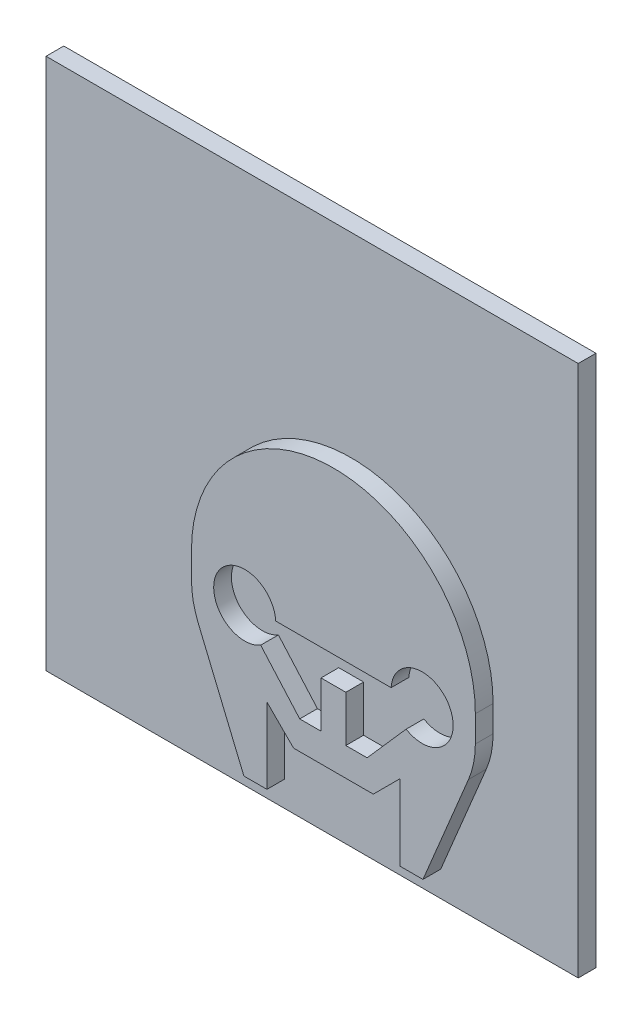
ISO-10303-21;
HEADER;
FILE_DESCRIPTION(('STEP AP214'),'2;1');
FILE_NAME('part.step','',(''),(''),'','','');
FILE_SCHEMA(('AUTOMOTIVE_DESIGN { 1 0 10303 214 1 1 1 1 }'));
ENDSEC;
DATA;
#1=APPLICATION_CONTEXT('core data for automotive mechanical design processes');
#2=APPLICATION_PROTOCOL_DEFINITION('international standard','automotive_design',2000,#1);
#3=PRODUCT_CONTEXT('',#1,'mechanical');
#4=PRODUCT('Part','Part','',(#3));
#5=PRODUCT_RELATED_PRODUCT_CATEGORY('part','',(#4));
#6=PRODUCT_DEFINITION_FORMATION('','',#4);
#7=PRODUCT_DEFINITION_CONTEXT('part definition',#1,'design');
#8=PRODUCT_DEFINITION('design','',#6,#7);
#9=PRODUCT_DEFINITION_SHAPE('','',#8);
#10=(LENGTH_UNIT() NAMED_UNIT(*) SI_UNIT(.MILLI.,.METRE.));
#11=(NAMED_UNIT(*) PLANE_ANGLE_UNIT() SI_UNIT($,.RADIAN.));
#12=(NAMED_UNIT(*) SI_UNIT($,.STERADIAN.) SOLID_ANGLE_UNIT());
#13=UNCERTAINTY_MEASURE_WITH_UNIT(LENGTH_MEASURE(1.E-05),#10,'distance_accuracy_value','');
#14=(GEOMETRIC_REPRESENTATION_CONTEXT(3) GLOBAL_UNCERTAINTY_ASSIGNED_CONTEXT((#13)) GLOBAL_UNIT_ASSIGNED_CONTEXT((#10,
#11,#12)) REPRESENTATION_CONTEXT('',''));
#15=CARTESIAN_POINT('',(0.,0.,0.));
#16=DIRECTION('',(0.,0.,1.));
#17=DIRECTION('',(1.,0.,0.));
#18=AXIS2_PLACEMENT_3D('',#15,#16,#17);
#19=CARTESIAN_POINT('',(0.,0.,10.));
#20=DIRECTION('',(0.,0.,-1.));
#21=DIRECTION('',(-1.,0.,0.));
#22=AXIS2_PLACEMENT_3D('',#19,#20,#21);
#23=PLANE('',#22);
#24=DIRECTION('',(0.,-1.,0.));
#25=VECTOR('',#24,1.);
#26=CARTESIAN_POINT('',(252.,0.,10.));
#27=LINE('',#26,#25);
#28=CARTESIAN_POINT('',(252.,110.,10.));
#29=VERTEX_POINT('',#28);
#30=CARTESIAN_POINT('',(252.,95.2298661303996,10.));
#31=VERTEX_POINT('',#30);
#32=EDGE_CURVE('E308',#29,#31,#27,.T.);
#33=ORIENTED_EDGE('',*,*,#32,.T.);
#34=CARTESIAN_POINT('',(202.,95.2298661303996,10.));
#35=DIRECTION('',(0.,0.,1.));
#36=DIRECTION('',(1.,0.,0.));
#37=AXIS2_PLACEMENT_3D('',#34,#35,#36);
#38=CIRCLE('',#37,50.);
#39=CARTESIAN_POINT('',(248.153836394722,75.9990734777494,10.));
#40=VERTEX_POINT('',#39);
#41=EDGE_CURVE('E58',#31,#40,#38,.F.);
#42=ORIENTED_EDGE('',*,*,#41,.T.);
#43=DIRECTION('',(-0.384615853053004,-0.923076727894442,0.));
#44=VECTOR('',#43,1.);
#45=CARTESIAN_POINT('',(184.462652845154,-76.859548547271,10.));
#46=LINE('',#45,#44);
#47=CARTESIAN_POINT('',(222.47286206477,14.3648231849862,10.));
#48=VERTEX_POINT('',#47);
#49=EDGE_CURVE('E336',#40,#48,#46,.T.);
#50=ORIENTED_EDGE('',*,*,#49,.T.);
#51=DIRECTION('',(-1.,0.,0.));
#52=VECTOR('',#51,1.);
#53=CARTESIAN_POINT('',(0.,14.3648231849862,10.));
#54=LINE('',#53,#52);
#55=CARTESIAN_POINT('',(209.47286206477,14.3648231849862,10.));
#56=VERTEX_POINT('',#55);
#57=EDGE_CURVE('E333',#48,#56,#54,.T.);
#58=ORIENTED_EDGE('',*,*,#57,.T.);
#59=DIRECTION('',(0.,1.,0.));
#60=VECTOR('',#59,1.);
#61=CARTESIAN_POINT('',(209.47286206477,0.,10.));
#62=LINE('',#61,#60);
#63=CARTESIAN_POINT('',(209.47286206477,57.,10.));
#64=VERTEX_POINT('',#63);
#65=EDGE_CURVE('E330',#56,#64,#62,.T.);
#66=ORIENTED_EDGE('',*,*,#65,.T.);
#67=DIRECTION('',(-0.707106781186544,-0.707106781186551,0.));
#68=VECTOR('',#67,1.);
#69=CARTESIAN_POINT('',(76.236431032386,-76.2364310323852,10.));
#70=LINE('',#69,#68);
#71=CARTESIAN_POINT('',(194.47286206477,42.,10.));
#72=VERTEX_POINT('',#71);
#73=EDGE_CURVE('E327',#64,#72,#70,.T.);
#74=ORIENTED_EDGE('',*,*,#73,.T.);
#75=DIRECTION('',(1.,0.,0.));
#76=VECTOR('',#75,1.);
#77=CARTESIAN_POINT('',(0.,42.,10.));
#78=LINE('',#77,#76);
#79=CARTESIAN_POINT('',(149.52713793523,42.,10.));
#80=VERTEX_POINT('',#79);
#81=EDGE_CURVE('E324',#80,#72,#78,.T.);
#82=ORIENTED_EDGE('',*,*,#81,.F.);
#83=DIRECTION('',(0.707106781186544,-0.707106781186551,0.));
#84=VECTOR('',#83,1.);
#85=CARTESIAN_POINT('',(95.7635689676158,95.7635689676148,10.));
#86=LINE('',#85,#84);
#87=CARTESIAN_POINT('',(134.52713793523,57.,10.));
#88=VERTEX_POINT('',#87);
#89=EDGE_CURVE('E322',#88,#80,#86,.T.);
#90=ORIENTED_EDGE('',*,*,#89,.F.);
#91=DIRECTION('',(0.,1.,0.));
#92=VECTOR('',#91,1.);
#93=CARTESIAN_POINT('',(134.52713793523,0.,10.));
#94=LINE('',#93,#92);
#95=CARTESIAN_POINT('',(134.52713793523,14.3648231849862,10.));
#96=VERTEX_POINT('',#95);
#97=EDGE_CURVE('E320',#96,#88,#94,.T.);
#98=ORIENTED_EDGE('',*,*,#97,.F.);
#99=DIRECTION('',(1.,0.,0.));
#100=VECTOR('',#99,1.);
#101=CARTESIAN_POINT('',(0.,14.3648231849862,10.));
#102=LINE('',#101,#100);
#103=CARTESIAN_POINT('',(121.52713793523,14.3648231849862,10.));
#104=VERTEX_POINT('',#103);
#105=EDGE_CURVE('E318',#104,#96,#102,.T.);
#106=ORIENTED_EDGE('',*,*,#105,.F.);
#107=DIRECTION('',(0.384615853053004,-0.923076727894442,0.));
#108=VECTOR('',#107,1.);
#109=CARTESIAN_POINT('',(108.649649234473,45.2707518903078,10.));
#110=LINE('',#109,#108);
#111=CARTESIAN_POINT('',(95.8461636052779,75.9990734777494,10.));
#112=VERTEX_POINT('',#111);
#113=EDGE_CURVE('E316',#112,#104,#110,.T.);
#114=ORIENTED_EDGE('',*,*,#113,.F.);
#115=CARTESIAN_POINT('',(142.,95.2298661303996,10.));
#116=DIRECTION('',(0.,0.,1.));
#117=DIRECTION('',(1.,0.,0.));
#118=AXIS2_PLACEMENT_3D('',#115,#116,#117);
#119=CIRCLE('',#118,50.);
#120=CARTESIAN_POINT('',(92.,95.2298661303996,10.));
#121=VERTEX_POINT('',#120);
#122=EDGE_CURVE('E314',#121,#112,#119,.T.);
#123=ORIENTED_EDGE('',*,*,#122,.F.);
#124=DIRECTION('',(0.,-1.,0.));
#125=VECTOR('',#124,1.);
#126=CARTESIAN_POINT('',(92.0000000000003,2.59325302585117E-13,10.));
#127=LINE('',#126,#125);
#128=CARTESIAN_POINT('',(92.,110.,10.));
#129=VERTEX_POINT('',#128);
#130=EDGE_CURVE('E312',#129,#121,#127,.T.);
#131=ORIENTED_EDGE('',*,*,#130,.F.);
#132=CARTESIAN_POINT('',(172.,110.,10.));
#133=DIRECTION('',(0.,0.,1.));
#134=DIRECTION('',(1.,0.,0.));
#135=AXIS2_PLACEMENT_3D('',#132,#133,#134);
#136=CIRCLE('',#135,80.);
#137=EDGE_CURVE('E310',#29,#129,#136,.T.);
#138=ORIENTED_EDGE('',*,*,#137,.F.);
#139=EDGE_LOOP('',(#33,#42,#50,#58,#66,#74,#82,#90,#98,#106,#114,#123,#131,#138));
#140=FACE_BOUND('',#139,.T.);
#141=DIRECTION('',(0.,-1.,0.));
#142=VECTOR('',#141,1.);
#143=CARTESIAN_POINT('',(0.,0.,10.));
#144=LINE('',#143,#142);
#145=CARTESIAN_POINT('',(0.,300.,10.));
#146=VERTEX_POINT('',#145);
#147=CARTESIAN_POINT('',(0.,0.,10.));
#148=VERTEX_POINT('',#147);
#149=EDGE_CURVE('E417',#146,#148,#144,.T.);
#150=ORIENTED_EDGE('',*,*,#149,.T.);
#151=DIRECTION('',(1.,0.,0.));
#152=VECTOR('',#151,1.);
#153=CARTESIAN_POINT('',(0.,0.,10.));
#154=LINE('',#153,#152);
#155=CARTESIAN_POINT('',(300.,0.,10.));
#156=VERTEX_POINT('',#155);
#157=EDGE_CURVE('E420',#148,#156,#154,.T.);
#158=ORIENTED_EDGE('',*,*,#157,.T.);
#159=DIRECTION('',(0.,1.,0.));
#160=VECTOR('',#159,1.);
#161=CARTESIAN_POINT('',(300.,0.,10.));
#162=LINE('',#161,#160);
#163=CARTESIAN_POINT('',(300.,300.,10.));
#164=VERTEX_POINT('',#163);
#165=EDGE_CURVE('E423',#156,#164,#162,.T.);
#166=ORIENTED_EDGE('',*,*,#165,.T.);
#167=DIRECTION('',(-1.,0.,0.));
#168=VECTOR('',#167,1.);
#169=CARTESIAN_POINT('',(0.,300.,10.));
#170=LINE('',#169,#168);
#171=EDGE_CURVE('E425',#164,#146,#170,.T.);
#172=ORIENTED_EDGE('',*,*,#171,.T.);
#173=EDGE_LOOP('',(#150,#158,#166,#172));
#174=FACE_BOUND('',#173,.T.);
#175=ADVANCED_FACE('F43',(#140,#174),#23,.F.);
#176=CARTESIAN_POINT('',(0.,0.,10.));
#177=DIRECTION('',(1.,0.,0.));
#178=DIRECTION('',(0.,0.,-1.));
#179=AXIS2_PLACEMENT_3D('',#176,#177,#178);
#180=PLANE('',#179);
#181=DIRECTION('',(0.,-1.,0.));
#182=VECTOR('',#181,1.);
#183=CARTESIAN_POINT('',(0.,0.,0.));
#184=LINE('',#183,#182);
#185=CARTESIAN_POINT('',(0.,300.,0.));
#186=VERTEX_POINT('',#185);
#187=CARTESIAN_POINT('',(0.,0.,0.));
#188=VERTEX_POINT('',#187);
#189=EDGE_CURVE('E385',#186,#188,#184,.T.);
#190=ORIENTED_EDGE('',*,*,#189,.T.);
#191=DIRECTION('',(0.,0.,-1.));
#192=VECTOR('',#191,1.);
#193=CARTESIAN_POINT('',(0.,0.,10.));
#194=LINE('',#193,#192);
#195=EDGE_CURVE('E11',#148,#188,#194,.T.);
#196=ORIENTED_EDGE('',*,*,#195,.F.);
#197=ORIENTED_EDGE('',*,*,#149,.F.);
#198=DIRECTION('',(0.,0.,-1.));
#199=VECTOR('',#198,1.);
#200=CARTESIAN_POINT('',(0.,300.,10.));
#201=LINE('',#200,#199);
#202=EDGE_CURVE('E427',#146,#186,#201,.T.);
#203=ORIENTED_EDGE('',*,*,#202,.T.);
#204=EDGE_LOOP('',(#190,#196,#197,#203));
#205=FACE_BOUND('',#204,.T.);
#206=ADVANCED_FACE('F45',(#205),#180,.F.);
#207=CARTESIAN_POINT('',(0.,0.,10.));
#208=DIRECTION('',(0.,1.,0.));
#209=DIRECTION('',(0.,0.,1.));
#210=AXIS2_PLACEMENT_3D('',#207,#208,#209);
#211=PLANE('',#210);
#212=DIRECTION('',(1.,0.,0.));
#213=VECTOR('',#212,1.);
#214=CARTESIAN_POINT('',(0.,0.,0.));
#215=LINE('',#214,#213);
#216=CARTESIAN_POINT('',(300.,0.,0.));
#217=VERTEX_POINT('',#216);
#218=EDGE_CURVE('E430',#188,#217,#215,.T.);
#219=ORIENTED_EDGE('',*,*,#218,.T.);
#220=DIRECTION('',(0.,0.,-1.));
#221=VECTOR('',#220,1.);
#222=CARTESIAN_POINT('',(300.,0.,10.));
#223=LINE('',#222,#221);
#224=EDGE_CURVE('E51',#156,#217,#223,.T.);
#225=ORIENTED_EDGE('',*,*,#224,.F.);
#226=ORIENTED_EDGE('',*,*,#157,.F.);
#227=ORIENTED_EDGE('',*,*,#195,.T.);
#228=EDGE_LOOP('',(#219,#225,#226,#227));
#229=FACE_BOUND('',#228,.T.);
#230=ADVANCED_FACE('F459',(#229),#211,.F.);
#231=CARTESIAN_POINT('',(300.,0.,10.));
#232=DIRECTION('',(-1.,0.,0.));
#233=DIRECTION('',(0.,0.,1.));
#234=AXIS2_PLACEMENT_3D('',#231,#232,#233);
#235=PLANE('',#234);
#236=DIRECTION('',(0.,1.,0.));
#237=VECTOR('',#236,1.);
#238=CARTESIAN_POINT('',(300.,0.,0.));
#239=LINE('',#238,#237);
#240=CARTESIAN_POINT('',(300.,300.,0.));
#241=VERTEX_POINT('',#240);
#242=EDGE_CURVE('E432',#217,#241,#239,.T.);
#243=ORIENTED_EDGE('',*,*,#242,.T.);
#244=DIRECTION('',(0.,0.,-1.));
#245=VECTOR('',#244,1.);
#246=CARTESIAN_POINT('',(300.,300.,10.));
#247=LINE('',#246,#245);
#248=EDGE_CURVE('E437',#164,#241,#247,.T.);
#249=ORIENTED_EDGE('',*,*,#248,.F.);
#250=ORIENTED_EDGE('',*,*,#165,.F.);
#251=ORIENTED_EDGE('',*,*,#224,.T.);
#252=EDGE_LOOP('',(#243,#249,#250,#251));
#253=FACE_BOUND('',#252,.T.);
#254=ADVANCED_FACE('F444',(#253),#235,.F.);
#255=CARTESIAN_POINT('',(0.,300.,10.));
#256=DIRECTION('',(0.,-1.,0.));
#257=DIRECTION('',(0.,0.,-1.));
#258=AXIS2_PLACEMENT_3D('',#255,#256,#257);
#259=PLANE('',#258);
#260=DIRECTION('',(-1.,0.,0.));
#261=VECTOR('',#260,1.);
#262=CARTESIAN_POINT('',(0.,300.,0.));
#263=LINE('',#262,#261);
#264=EDGE_CURVE('E421',#241,#186,#263,.T.);
#265=ORIENTED_EDGE('',*,*,#264,.T.);
#266=ORIENTED_EDGE('',*,*,#202,.F.);
#267=ORIENTED_EDGE('',*,*,#171,.F.);
#268=ORIENTED_EDGE('',*,*,#248,.T.);
#269=EDGE_LOOP('',(#265,#266,#267,#268));
#270=FACE_BOUND('',#269,.T.);
#271=ADVANCED_FACE('F453',(#270),#259,.F.);
#272=CARTESIAN_POINT('',(0.,0.,0.));
#273=DIRECTION('',(0.,0.,-1.));
#274=DIRECTION('',(-1.,0.,0.));
#275=AXIS2_PLACEMENT_3D('',#272,#273,#274);
#276=PLANE('',#275);
#277=ORIENTED_EDGE('',*,*,#189,.F.);
#278=ORIENTED_EDGE('',*,*,#264,.F.);
#279=ORIENTED_EDGE('',*,*,#242,.F.);
#280=ORIENTED_EDGE('',*,*,#218,.F.);
#281=EDGE_LOOP('',(#277,#278,#279,#280));
#282=FACE_BOUND('',#281,.T.);
#283=ADVANCED_FACE('F450',(#282),#276,.T.);
#284=CARTESIAN_POINT('',(222.,98.,20.));
#285=DIRECTION('',(0.,0.,-1.));
#286=DIRECTION('',(-1.,0.,0.));
#287=AXIS2_PLACEMENT_3D('',#284,#285,#286);
#288=CYLINDRICAL_SURFACE('',#287,17.5);
#289=CARTESIAN_POINT('',(222.,98.,10.));
#290=DIRECTION('',(0.,0.,1.));
#291=DIRECTION('',(1.,0.,0.));
#292=AXIS2_PLACEMENT_3D('',#289,#290,#291);
#293=CIRCLE('',#292,17.5);
#294=CARTESIAN_POINT('',(213.,82.9916689801964,10.));
#295=VERTEX_POINT('',#294);
#296=CARTESIAN_POINT('',(204.528594790344,99.,10.));
#297=VERTEX_POINT('',#296);
#298=EDGE_CURVE('E66',#295,#297,#293,.T.);
#299=ORIENTED_EDGE('',*,*,#298,.F.);
#300=DIRECTION('',(0.,0.,-1.));
#301=VECTOR('',#300,1.);
#302=CARTESIAN_POINT('',(213.,82.9916689801964,20.));
#303=LINE('',#302,#301);
#304=CARTESIAN_POINT('',(213.,82.9916689801964,20.));
#305=VERTEX_POINT('',#304);
#306=EDGE_CURVE('E383',#305,#295,#303,.T.);
#307=ORIENTED_EDGE('',*,*,#306,.F.);
#308=CARTESIAN_POINT('',(222.,98.,20.));
#309=DIRECTION('',(0.,0.,1.));
#310=DIRECTION('',(1.,0.,0.));
#311=AXIS2_PLACEMENT_3D('',#308,#309,#310);
#312=CIRCLE('',#311,17.5);
#313=CARTESIAN_POINT('',(204.528594790344,99.,20.));
#314=VERTEX_POINT('',#313);
#315=EDGE_CURVE('E278',#305,#314,#312,.T.);
#316=ORIENTED_EDGE('',*,*,#315,.T.);
#317=DIRECTION('',(0.,0.,-1.));
#318=VECTOR('',#317,1.);
#319=CARTESIAN_POINT('',(204.528594790344,99.,20.));
#320=LINE('',#319,#318);
#321=EDGE_CURVE('E235',#314,#297,#320,.T.);
#322=ORIENTED_EDGE('',*,*,#321,.T.);
#323=EDGE_LOOP('',(#299,#307,#316,#322));
#324=FACE_BOUND('',#323,.T.);
#325=ADVANCED_FACE('F490',(#324),#288,.F.);
#326=CARTESIAN_POINT('',(78.8448330204144,-69.4065821623844,20.));
#327=DIRECTION('',(-0.750604305375357,0.660751978242955,0.));
#328=DIRECTION('',(-0.660751978242955,-0.750604305375357,0.));
#329=AXIS2_PLACEMENT_3D('',#326,#327,#328);
#330=PLANE('',#329);
#331=DIRECTION('',(0.660751978242955,0.750604305375357,0.));
#332=VECTOR('',#331,1.);
#333=CARTESIAN_POINT('',(78.8448330204144,-69.4065821623844,10.));
#334=LINE('',#333,#332);
#335=CARTESIAN_POINT('',(191.,58.,10.));
#336=VERTEX_POINT('',#335);
#337=EDGE_CURVE('E340',#336,#295,#334,.T.);
#338=ORIENTED_EDGE('',*,*,#337,.F.);
#339=DIRECTION('',(0.,0.,-1.));
#340=VECTOR('',#339,1.);
#341=CARTESIAN_POINT('',(191.,58.,20.));
#342=LINE('',#341,#340);
#343=CARTESIAN_POINT('',(191.,58.,20.));
#344=VERTEX_POINT('',#343);
#345=EDGE_CURVE('E381',#344,#336,#342,.T.);
#346=ORIENTED_EDGE('',*,*,#345,.F.);
#347=DIRECTION('',(0.660751978242955,0.750604305375357,0.));
#348=VECTOR('',#347,1.);
#349=CARTESIAN_POINT('',(78.8448330204144,-69.4065821623844,20.));
#350=LINE('',#349,#348);
#351=EDGE_CURVE('E281',#344,#305,#350,.T.);
#352=ORIENTED_EDGE('',*,*,#351,.T.);
#353=ORIENTED_EDGE('',*,*,#306,.T.);
#354=EDGE_LOOP('',(#338,#346,#352,#353));
#355=FACE_BOUND('',#354,.T.);
#356=ADVANCED_FACE('F487',(#355),#330,.T.);
#357=CARTESIAN_POINT('',(0.,57.9999999999999,20.));
#358=DIRECTION('',(0.,1.,0.));
#359=DIRECTION('',(-1.,0.,0.));
#360=AXIS2_PLACEMENT_3D('',#357,#358,#359);
#361=PLANE('',#360);
#362=DIRECTION('',(1.,0.,0.));
#363=VECTOR('',#362,1.);
#364=CARTESIAN_POINT('',(0.,57.9999999999999,10.));
#365=LINE('',#364,#363);
#366=CARTESIAN_POINT('',(179.,58.,10.));
#367=VERTEX_POINT('',#366);
#368=EDGE_CURVE('E343',#367,#336,#365,.T.);
#369=ORIENTED_EDGE('',*,*,#368,.F.);
#370=DIRECTION('',(0.,0.,-1.));
#371=VECTOR('',#370,1.);
#372=CARTESIAN_POINT('',(179.,58.,20.));
#373=LINE('',#372,#371);
#374=CARTESIAN_POINT('',(179.,58.,20.));
#375=VERTEX_POINT('',#374);
#376=EDGE_CURVE('E379',#375,#367,#373,.T.);
#377=ORIENTED_EDGE('',*,*,#376,.F.);
#378=DIRECTION('',(1.,0.,0.));
#379=VECTOR('',#378,1.);
#380=CARTESIAN_POINT('',(0.,57.9999999999999,20.));
#381=LINE('',#380,#379);
#382=EDGE_CURVE('E284',#375,#344,#381,.T.);
#383=ORIENTED_EDGE('',*,*,#382,.T.);
#384=ORIENTED_EDGE('',*,*,#345,.T.);
#385=EDGE_LOOP('',(#369,#377,#383,#384));
#386=FACE_BOUND('',#385,.T.);
#387=ADVANCED_FACE('F521',(#386),#361,.T.);
#388=CARTESIAN_POINT('',(179.,0.,20.));
#389=DIRECTION('',(1.,0.,0.));
#390=DIRECTION('',(0.,0.,-1.));
#391=AXIS2_PLACEMENT_3D('',#388,#389,#390);
#392=PLANE('',#391);
#393=DIRECTION('',(0.,-1.,0.));
#394=VECTOR('',#393,1.);
#395=CARTESIAN_POINT('',(179.,0.,10.));
#396=LINE('',#395,#394);
#397=CARTESIAN_POINT('',(179.,84.,10.));
#398=VERTEX_POINT('',#397);
#399=EDGE_CURVE('E346',#398,#367,#396,.T.);
#400=ORIENTED_EDGE('',*,*,#399,.F.);
#401=DIRECTION('',(0.,0.,-1.));
#402=VECTOR('',#401,1.);
#403=CARTESIAN_POINT('',(179.,84.,20.));
#404=LINE('',#403,#402);
#405=CARTESIAN_POINT('',(179.,84.,20.));
#406=VERTEX_POINT('',#405);
#407=EDGE_CURVE('E377',#406,#398,#404,.T.);
#408=ORIENTED_EDGE('',*,*,#407,.F.);
#409=DIRECTION('',(0.,-1.,0.));
#410=VECTOR('',#409,1.);
#411=CARTESIAN_POINT('',(179.,0.,20.));
#412=LINE('',#411,#410);
#413=EDGE_CURVE('E287',#406,#375,#412,.T.);
#414=ORIENTED_EDGE('',*,*,#413,.T.);
#415=ORIENTED_EDGE('',*,*,#376,.T.);
#416=EDGE_LOOP('',(#400,#408,#414,#415));
#417=FACE_BOUND('',#416,.T.);
#418=ADVANCED_FACE('F519',(#417),#392,.T.);
#419=CARTESIAN_POINT('',(0.,84.,20.));
#420=DIRECTION('',(0.,-1.,0.));
#421=DIRECTION('',(0.,0.,-1.));
#422=AXIS2_PLACEMENT_3D('',#419,#420,#421);
#423=PLANE('',#422);
#424=DIRECTION('',(-1.,0.,0.));
#425=VECTOR('',#424,1.);
#426=CARTESIAN_POINT('',(0.,84.,10.));
#427=LINE('',#426,#425);
#428=CARTESIAN_POINT('',(165.,84.,10.));
#429=VERTEX_POINT('',#428);
#430=EDGE_CURVE('E349',#398,#429,#427,.T.);
#431=ORIENTED_EDGE('',*,*,#430,.T.);
#432=DIRECTION('',(0.,0.,-1.));
#433=VECTOR('',#432,1.);
#434=CARTESIAN_POINT('',(165.,84.,20.));
#435=LINE('',#434,#433);
#436=CARTESIAN_POINT('',(165.,84.,20.));
#437=VERTEX_POINT('',#436);
#438=EDGE_CURVE('E375',#437,#429,#435,.T.);
#439=ORIENTED_EDGE('',*,*,#438,.F.);
#440=DIRECTION('',(-1.,0.,0.));
#441=VECTOR('',#440,1.);
#442=CARTESIAN_POINT('',(0.,84.,20.));
#443=LINE('',#442,#441);
#444=EDGE_CURVE('E290',#406,#437,#443,.T.);
#445=ORIENTED_EDGE('',*,*,#444,.F.);
#446=ORIENTED_EDGE('',*,*,#407,.T.);
#447=EDGE_LOOP('',(#431,#439,#445,#446));
#448=FACE_BOUND('',#447,.T.);
#449=ADVANCED_FACE('F515',(#448),#423,.F.);
#450=CARTESIAN_POINT('',(165.,0.,20.));
#451=DIRECTION('',(1.,0.,0.));
#452=DIRECTION('',(0.,0.,-1.));
#453=AXIS2_PLACEMENT_3D('',#450,#451,#452);
#454=PLANE('',#453);
#455=DIRECTION('',(0.,-1.,0.));
#456=VECTOR('',#455,1.);
#457=CARTESIAN_POINT('',(165.,0.,10.));
#458=LINE('',#457,#456);
#459=CARTESIAN_POINT('',(165.,58.,10.));
#460=VERTEX_POINT('',#459);
#461=EDGE_CURVE('E352',#429,#460,#458,.T.);
#462=ORIENTED_EDGE('',*,*,#461,.T.);
#463=DIRECTION('',(0.,0.,-1.));
#464=VECTOR('',#463,1.);
#465=CARTESIAN_POINT('',(165.,58.,20.));
#466=LINE('',#465,#464);
#467=CARTESIAN_POINT('',(165.,58.,20.));
#468=VERTEX_POINT('',#467);
#469=EDGE_CURVE('E373',#468,#460,#466,.T.);
#470=ORIENTED_EDGE('',*,*,#469,.F.);
#471=DIRECTION('',(0.,-1.,0.));
#472=VECTOR('',#471,1.);
#473=CARTESIAN_POINT('',(165.,0.,20.));
#474=LINE('',#473,#472);
#475=EDGE_CURVE('E293',#437,#468,#474,.T.);
#476=ORIENTED_EDGE('',*,*,#475,.F.);
#477=ORIENTED_EDGE('',*,*,#438,.T.);
#478=EDGE_LOOP('',(#462,#470,#476,#477));
#479=FACE_BOUND('',#478,.T.);
#480=ADVANCED_FACE('F511',(#479),#454,.F.);
#481=CARTESIAN_POINT('',(0.,58.,20.));
#482=DIRECTION('',(0.,-1.,0.));
#483=DIRECTION('',(0.,0.,-1.));
#484=AXIS2_PLACEMENT_3D('',#481,#482,#483);
#485=PLANE('',#484);
#486=DIRECTION('',(-1.,0.,0.));
#487=VECTOR('',#486,1.);
#488=CARTESIAN_POINT('',(0.,58.,10.));
#489=LINE('',#488,#487);
#490=CARTESIAN_POINT('',(153.,58.,10.));
#491=VERTEX_POINT('',#490);
#492=EDGE_CURVE('E355',#460,#491,#489,.T.);
#493=ORIENTED_EDGE('',*,*,#492,.T.);
#494=DIRECTION('',(0.,0.,-1.));
#495=VECTOR('',#494,1.);
#496=CARTESIAN_POINT('',(153.,58.,20.));
#497=LINE('',#496,#495);
#498=CARTESIAN_POINT('',(153.,58.,20.));
#499=VERTEX_POINT('',#498);
#500=EDGE_CURVE('E371',#499,#491,#497,.T.);
#501=ORIENTED_EDGE('',*,*,#500,.F.);
#502=DIRECTION('',(-1.,0.,0.));
#503=VECTOR('',#502,1.);
#504=CARTESIAN_POINT('',(0.,58.,20.));
#505=LINE('',#504,#503);
#506=EDGE_CURVE('E296',#468,#499,#505,.T.);
#507=ORIENTED_EDGE('',*,*,#506,.F.);
#508=ORIENTED_EDGE('',*,*,#469,.T.);
#509=EDGE_LOOP('',(#493,#501,#507,#508));
#510=FACE_BOUND('',#509,.T.);
#511=ADVANCED_FACE('F506',(#510),#485,.F.);
#512=CARTESIAN_POINT('',(114.967114176905,101.204786038745,20.));
#513=DIRECTION('',(-0.750604305375357,-0.660751978242955,0.));
#514=DIRECTION('',(0.660751978242955,-0.750604305375357,0.));
#515=AXIS2_PLACEMENT_3D('',#512,#513,#514);
#516=PLANE('',#515);
#517=DIRECTION('',(-0.660751978242955,0.750604305375357,0.));
#518=VECTOR('',#517,1.);
#519=CARTESIAN_POINT('',(114.967114176905,101.204786038745,10.));
#520=LINE('',#519,#518);
#521=CARTESIAN_POINT('',(131.,82.9916689801964,10.));
#522=VERTEX_POINT('',#521);
#523=EDGE_CURVE('E358',#491,#522,#520,.T.);
#524=ORIENTED_EDGE('',*,*,#523,.T.);
#525=DIRECTION('',(0.,0.,-1.));
#526=VECTOR('',#525,1.);
#527=CARTESIAN_POINT('',(131.,82.9916689801964,20.));
#528=LINE('',#527,#526);
#529=CARTESIAN_POINT('',(131.,82.9916689801964,20.));
#530=VERTEX_POINT('',#529);
#531=EDGE_CURVE('E369',#530,#522,#528,.T.);
#532=ORIENTED_EDGE('',*,*,#531,.F.);
#533=DIRECTION('',(-0.660751978242955,0.750604305375357,0.));
#534=VECTOR('',#533,1.);
#535=CARTESIAN_POINT('',(114.967114176905,101.204786038745,20.));
#536=LINE('',#535,#534);
#537=EDGE_CURVE('E299',#499,#530,#536,.T.);
#538=ORIENTED_EDGE('',*,*,#537,.F.);
#539=ORIENTED_EDGE('',*,*,#500,.T.);
#540=EDGE_LOOP('',(#524,#532,#538,#539));
#541=FACE_BOUND('',#540,.T.);
#542=ADVANCED_FACE('F503',(#541),#516,.F.);
#543=CARTESIAN_POINT('',(122.,98.,20.));
#544=DIRECTION('',(0.,0.,-1.));
#545=DIRECTION('',(-1.,0.,0.));
#546=AXIS2_PLACEMENT_3D('',#543,#544,#545);
#547=CYLINDRICAL_SURFACE('',#546,17.5);
#548=CARTESIAN_POINT('',(122.,98.,10.));
#549=DIRECTION('',(0.,0.,1.));
#550=DIRECTION('',(1.,0.,0.));
#551=AXIS2_PLACEMENT_3D('',#548,#549,#550);
#552=CIRCLE('',#551,17.5);
#553=CARTESIAN_POINT('',(139.471405209656,99.,10.));
#554=VERTEX_POINT('',#553);
#555=EDGE_CURVE('E361',#554,#522,#552,.T.);
#556=ORIENTED_EDGE('',*,*,#555,.F.);
#557=DIRECTION('',(0.,0.,-1.));
#558=VECTOR('',#557,1.);
#559=CARTESIAN_POINT('',(139.471405209656,99.,20.));
#560=LINE('',#559,#558);
#561=CARTESIAN_POINT('',(139.471405209656,99.,20.));
#562=VERTEX_POINT('',#561);
#563=EDGE_CURVE('E367',#562,#554,#560,.T.);
#564=ORIENTED_EDGE('',*,*,#563,.F.);
#565=CARTESIAN_POINT('',(122.,98.,20.));
#566=DIRECTION('',(0.,0.,1.));
#567=DIRECTION('',(1.,0.,0.));
#568=AXIS2_PLACEMENT_3D('',#565,#566,#567);
#569=CIRCLE('',#568,17.5);
#570=EDGE_CURVE('E301',#562,#530,#569,.T.);
#571=ORIENTED_EDGE('',*,*,#570,.T.);
#572=ORIENTED_EDGE('',*,*,#531,.T.);
#573=EDGE_LOOP('',(#556,#564,#571,#572));
#574=FACE_BOUND('',#573,.T.);
#575=ADVANCED_FACE('F500',(#574),#547,.F.);
#576=CARTESIAN_POINT('',(202.,95.2298661303996,20.));
#577=DIRECTION('',(0.,0.,-1.));
#578=DIRECTION('',(-1.,0.,0.));
#579=AXIS2_PLACEMENT_3D('',#576,#577,#578);
#580=CYLINDRICAL_SURFACE('',#579,50.);
#581=ORIENTED_EDGE('',*,*,#41,.F.);
#582=DIRECTION('',(0.,0.,-1.));
#583=VECTOR('',#582,1.);
#584=CARTESIAN_POINT('',(252.,95.2298661303996,20.));
#585=LINE('',#584,#583);
#586=CARTESIAN_POINT('',(252.,95.2298661303996,20.));
#587=VERTEX_POINT('',#586);
#588=EDGE_CURVE('E226',#587,#31,#585,.T.);
#589=ORIENTED_EDGE('',*,*,#588,.F.);
#590=CARTESIAN_POINT('',(202.,95.2298661303996,20.));
#591=DIRECTION('',(0.,0.,1.));
#592=DIRECTION('',(1.,0.,0.));
#593=AXIS2_PLACEMENT_3D('',#590,#591,#592);
#594=CIRCLE('',#593,50.);
#595=CARTESIAN_POINT('',(248.153836394722,75.9990734777494,20.));
#596=VERTEX_POINT('',#595);
#597=EDGE_CURVE('E229',#587,#596,#594,.F.);
#598=ORIENTED_EDGE('',*,*,#597,.T.);
#599=DIRECTION('',(0.,0.,-1.));
#600=VECTOR('',#599,1.);
#601=CARTESIAN_POINT('',(248.153836394722,75.9990734777494,20.));
#602=LINE('',#601,#600);
#603=EDGE_CURVE('E306',#596,#40,#602,.T.);
#604=ORIENTED_EDGE('',*,*,#603,.T.);
#605=EDGE_LOOP('',(#581,#589,#598,#604));
#606=FACE_BOUND('',#605,.T.);
#607=ADVANCED_FACE('F228',(#606),#580,.T.);
#608=CARTESIAN_POINT('',(252.,0.,20.));
#609=DIRECTION('',(1.,0.,0.));
#610=DIRECTION('',(0.,0.,-1.));
#611=AXIS2_PLACEMENT_3D('',#608,#609,#610);
#612=PLANE('',#611);
#613=ORIENTED_EDGE('',*,*,#32,.F.);
#614=DIRECTION('',(0.,0.,-1.));
#615=VECTOR('',#614,1.);
#616=CARTESIAN_POINT('',(252.,110.,20.));
#617=LINE('',#616,#615);
#618=CARTESIAN_POINT('',(252.,110.,20.));
#619=VERTEX_POINT('',#618);
#620=EDGE_CURVE('E236',#619,#29,#617,.T.);
#621=ORIENTED_EDGE('',*,*,#620,.F.);
#622=DIRECTION('',(0.,-1.,0.));
#623=VECTOR('',#622,1.);
#624=CARTESIAN_POINT('',(252.,0.,20.));
#625=LINE('',#624,#623);
#626=EDGE_CURVE('E242',#619,#587,#625,.T.);
#627=ORIENTED_EDGE('',*,*,#626,.T.);
#628=ORIENTED_EDGE('',*,*,#588,.T.);
#629=EDGE_LOOP('',(#613,#621,#627,#628));
#630=FACE_BOUND('',#629,.T.);
#631=ADVANCED_FACE('F248',(#630),#612,.T.);
#632=CARTESIAN_POINT('',(172.,110.,20.));
#633=DIRECTION('',(0.,0.,-1.));
#634=DIRECTION('',(-1.,0.,0.));
#635=AXIS2_PLACEMENT_3D('',#632,#633,#634);
#636=CYLINDRICAL_SURFACE('',#635,80.);
#637=ORIENTED_EDGE('',*,*,#137,.T.);
#638=DIRECTION('',(0.,0.,-1.));
#639=VECTOR('',#638,1.);
#640=CARTESIAN_POINT('',(92.,110.,20.));
#641=LINE('',#640,#639);
#642=CARTESIAN_POINT('',(92.,110.,20.));
#643=VERTEX_POINT('',#642);
#644=EDGE_CURVE('E413',#643,#129,#641,.T.);
#645=ORIENTED_EDGE('',*,*,#644,.F.);
#646=CARTESIAN_POINT('',(172.,110.,20.));
#647=DIRECTION('',(0.,0.,1.));
#648=DIRECTION('',(1.,0.,0.));
#649=AXIS2_PLACEMENT_3D('',#646,#647,#648);
#650=CIRCLE('',#649,80.);
#651=EDGE_CURVE('E250',#619,#643,#650,.T.);
#652=ORIENTED_EDGE('',*,*,#651,.F.);
#653=ORIENTED_EDGE('',*,*,#620,.T.);
#654=EDGE_LOOP('',(#637,#645,#652,#653));
#655=FACE_BOUND('',#654,.T.);
#656=ADVANCED_FACE('F576',(#655),#636,.T.);
#657=CARTESIAN_POINT('',(92.0000000000003,2.59325302585117E-13,20.));
#658=DIRECTION('',(1.,0.,0.));
#659=DIRECTION('',(0.,1.,0.));
#660=AXIS2_PLACEMENT_3D('',#657,#658,#659);
#661=PLANE('',#660);
#662=ORIENTED_EDGE('',*,*,#130,.T.);
#663=DIRECTION('',(0.,0.,-1.));
#664=VECTOR('',#663,1.);
#665=CARTESIAN_POINT('',(92.,95.2298661303996,20.));
#666=LINE('',#665,#664);
#667=CARTESIAN_POINT('',(92.,95.2298661303996,20.));
#668=VERTEX_POINT('',#667);
#669=EDGE_CURVE('E410',#668,#121,#666,.T.);
#670=ORIENTED_EDGE('',*,*,#669,.F.);
#671=DIRECTION('',(0.,-1.,0.));
#672=VECTOR('',#671,1.);
#673=CARTESIAN_POINT('',(92.0000000000003,2.59325302585117E-13,20.));
#674=LINE('',#673,#672);
#675=EDGE_CURVE('E252',#643,#668,#674,.T.);
#676=ORIENTED_EDGE('',*,*,#675,.F.);
#677=ORIENTED_EDGE('',*,*,#644,.T.);
#678=EDGE_LOOP('',(#662,#670,#676,#677));
#679=FACE_BOUND('',#678,.T.);
#680=ADVANCED_FACE('F572',(#679),#661,.F.);
#681=CARTESIAN_POINT('',(142.,95.2298661303996,20.));
#682=DIRECTION('',(0.,0.,-1.));
#683=DIRECTION('',(-1.,0.,0.));
#684=AXIS2_PLACEMENT_3D('',#681,#682,#683);
#685=CYLINDRICAL_SURFACE('',#684,50.);
#686=ORIENTED_EDGE('',*,*,#122,.T.);
#687=DIRECTION('',(0.,0.,-1.));
#688=VECTOR('',#687,1.);
#689=CARTESIAN_POINT('',(95.8461636052779,75.9990734777494,20.));
#690=LINE('',#689,#688);
#691=CARTESIAN_POINT('',(95.8461636052779,75.9990734777494,20.));
#692=VERTEX_POINT('',#691);
#693=EDGE_CURVE('E407',#692,#112,#690,.T.);
#694=ORIENTED_EDGE('',*,*,#693,.F.);
#695=CARTESIAN_POINT('',(142.,95.2298661303996,20.));
#696=DIRECTION('',(0.,0.,1.));
#697=DIRECTION('',(1.,0.,0.));
#698=AXIS2_PLACEMENT_3D('',#695,#696,#697);
#699=CIRCLE('',#698,50.);
#700=EDGE_CURVE('E256',#668,#692,#699,.T.);
#701=ORIENTED_EDGE('',*,*,#700,.F.);
#702=ORIENTED_EDGE('',*,*,#669,.T.);
#703=EDGE_LOOP('',(#686,#694,#701,#702));
#704=FACE_BOUND('',#703,.T.);
#705=ADVANCED_FACE('F568',(#704),#685,.T.);
#706=CARTESIAN_POINT('',(108.649649234473,45.2707518903078,20.));
#707=DIRECTION('',(0.923076727894442,0.384615853053004,0.));
#708=DIRECTION('',(-0.384615853053004,0.923076727894442,0.));
#709=AXIS2_PLACEMENT_3D('',#706,#707,#708);
#710=PLANE('',#709);
#711=ORIENTED_EDGE('',*,*,#113,.T.);
#712=DIRECTION('',(0.,0.,-1.));
#713=VECTOR('',#712,1.);
#714=CARTESIAN_POINT('',(121.52713793523,14.3648231849862,20.));
#715=LINE('',#714,#713);
#716=CARTESIAN_POINT('',(121.52713793523,14.3648231849862,20.));
#717=VERTEX_POINT('',#716);
#718=EDGE_CURVE('E404',#717,#104,#715,.T.);
#719=ORIENTED_EDGE('',*,*,#718,.F.);
#720=DIRECTION('',(0.384615853053004,-0.923076727894442,0.));
#721=VECTOR('',#720,1.);
#722=CARTESIAN_POINT('',(108.649649234473,45.2707518903078,20.));
#723=LINE('',#722,#721);
#724=EDGE_CURVE('E258',#692,#717,#723,.T.);
#725=ORIENTED_EDGE('',*,*,#724,.F.);
#726=ORIENTED_EDGE('',*,*,#693,.T.);
#727=EDGE_LOOP('',(#711,#719,#725,#726));
#728=FACE_BOUND('',#727,.T.);
#729=ADVANCED_FACE('F564',(#728),#710,.F.);
#730=CARTESIAN_POINT('',(0.,14.3648231849862,20.));
#731=DIRECTION('',(0.,1.,0.));
#732=DIRECTION('',(0.,0.,1.));
#733=AXIS2_PLACEMENT_3D('',#730,#731,#732);
#734=PLANE('',#733);
#735=ORIENTED_EDGE('',*,*,#105,.T.);
#736=DIRECTION('',(0.,0.,-1.));
#737=VECTOR('',#736,1.);
#738=CARTESIAN_POINT('',(134.52713793523,14.3648231849862,20.));
#739=LINE('',#738,#737);
#740=CARTESIAN_POINT('',(134.52713793523,14.3648231849862,20.));
#741=VERTEX_POINT('',#740);
#742=EDGE_CURVE('E401',#741,#96,#739,.T.);
#743=ORIENTED_EDGE('',*,*,#742,.F.);
#744=DIRECTION('',(1.,0.,0.));
#745=VECTOR('',#744,1.);
#746=CARTESIAN_POINT('',(0.,14.3648231849862,20.));
#747=LINE('',#746,#745);
#748=EDGE_CURVE('E260',#717,#741,#747,.T.);
#749=ORIENTED_EDGE('',*,*,#748,.F.);
#750=ORIENTED_EDGE('',*,*,#718,.T.);
#751=EDGE_LOOP('',(#735,#743,#749,#750));
#752=FACE_BOUND('',#751,.T.);
#753=ADVANCED_FACE('F560',(#752),#734,.F.);
#754=CARTESIAN_POINT('',(134.52713793523,0.,20.));
#755=DIRECTION('',(-1.,0.,0.));
#756=DIRECTION('',(0.,0.,1.));
#757=AXIS2_PLACEMENT_3D('',#754,#755,#756);
#758=PLANE('',#757);
#759=ORIENTED_EDGE('',*,*,#97,.T.);
#760=DIRECTION('',(0.,0.,-1.));
#761=VECTOR('',#760,1.);
#762=CARTESIAN_POINT('',(134.52713793523,57.,20.));
#763=LINE('',#762,#761);
#764=CARTESIAN_POINT('',(134.52713793523,57.,20.));
#765=VERTEX_POINT('',#764);
#766=EDGE_CURVE('E398',#765,#88,#763,.T.);
#767=ORIENTED_EDGE('',*,*,#766,.F.);
#768=DIRECTION('',(0.,1.,0.));
#769=VECTOR('',#768,1.);
#770=CARTESIAN_POINT('',(134.52713793523,0.,20.));
#771=LINE('',#770,#769);
#772=EDGE_CURVE('E262',#741,#765,#771,.T.);
#773=ORIENTED_EDGE('',*,*,#772,.F.);
#774=ORIENTED_EDGE('',*,*,#742,.T.);
#775=EDGE_LOOP('',(#759,#767,#773,#774));
#776=FACE_BOUND('',#775,.T.);
#777=ADVANCED_FACE('F556',(#776),#758,.F.);
#778=CARTESIAN_POINT('',(95.7635689676158,95.7635689676148,20.));
#779=DIRECTION('',(0.707106781186551,0.707106781186544,0.));
#780=DIRECTION('',(-0.707106781186544,0.707106781186551,0.));
#781=AXIS2_PLACEMENT_3D('',#778,#779,#780);
#782=PLANE('',#781);
#783=ORIENTED_EDGE('',*,*,#89,.T.);
#784=DIRECTION('',(0.,0.,-1.));
#785=VECTOR('',#784,1.);
#786=CARTESIAN_POINT('',(149.52713793523,42.,20.));
#787=LINE('',#786,#785);
#788=CARTESIAN_POINT('',(149.52713793523,42.,20.));
#789=VERTEX_POINT('',#788);
#790=EDGE_CURVE('E395',#789,#80,#787,.T.);
#791=ORIENTED_EDGE('',*,*,#790,.F.);
#792=DIRECTION('',(0.707106781186544,-0.707106781186551,0.));
#793=VECTOR('',#792,1.);
#794=CARTESIAN_POINT('',(95.7635689676158,95.7635689676148,20.));
#795=LINE('',#794,#793);
#796=EDGE_CURVE('E264',#765,#789,#795,.T.);
#797=ORIENTED_EDGE('',*,*,#796,.F.);
#798=ORIENTED_EDGE('',*,*,#766,.T.);
#799=EDGE_LOOP('',(#783,#791,#797,#798));
#800=FACE_BOUND('',#799,.T.);
#801=ADVANCED_FACE('F552',(#800),#782,.F.);
#802=CARTESIAN_POINT('',(0.,42.,20.));
#803=DIRECTION('',(0.,1.,0.));
#804=DIRECTION('',(-1.,0.,0.));
#805=AXIS2_PLACEMENT_3D('',#802,#803,#804);
#806=PLANE('',#805);
#807=ORIENTED_EDGE('',*,*,#81,.T.);
#808=DIRECTION('',(0.,0.,-1.));
#809=VECTOR('',#808,1.);
#810=CARTESIAN_POINT('',(194.47286206477,42.,20.));
#811=LINE('',#810,#809);
#812=CARTESIAN_POINT('',(194.47286206477,42.,20.));
#813=VERTEX_POINT('',#812);
#814=EDGE_CURVE('E393',#813,#72,#811,.T.);
#815=ORIENTED_EDGE('',*,*,#814,.F.);
#816=DIRECTION('',(1.,0.,0.));
#817=VECTOR('',#816,1.);
#818=CARTESIAN_POINT('',(0.,42.,20.));
#819=LINE('',#818,#817);
#820=EDGE_CURVE('E266',#789,#813,#819,.T.);
#821=ORIENTED_EDGE('',*,*,#820,.F.);
#822=ORIENTED_EDGE('',*,*,#790,.T.);
#823=EDGE_LOOP('',(#807,#815,#821,#822));
#824=FACE_BOUND('',#823,.T.);
#825=ADVANCED_FACE('F548',(#824),#806,.F.);
#826=CARTESIAN_POINT('',(76.236431032386,-76.2364310323852,20.));
#827=DIRECTION('',(0.707106781186551,-0.707106781186544,0.));
#828=DIRECTION('',(0.707106781186544,0.707106781186551,0.));
#829=AXIS2_PLACEMENT_3D('',#826,#827,#828);
#830=PLANE('',#829);
#831=ORIENTED_EDGE('',*,*,#73,.F.);
#832=DIRECTION('',(0.,0.,-1.));
#833=VECTOR('',#832,1.);
#834=CARTESIAN_POINT('',(209.47286206477,57.,20.));
#835=LINE('',#834,#833);
#836=CARTESIAN_POINT('',(209.47286206477,57.,20.));
#837=VERTEX_POINT('',#836);
#838=EDGE_CURVE('E391',#837,#64,#835,.T.);
#839=ORIENTED_EDGE('',*,*,#838,.F.);
#840=DIRECTION('',(-0.707106781186544,-0.707106781186551,0.));
#841=VECTOR('',#840,1.);
#842=CARTESIAN_POINT('',(76.236431032386,-76.2364310323852,20.));
#843=LINE('',#842,#841);
#844=EDGE_CURVE('E268',#837,#813,#843,.T.);
#845=ORIENTED_EDGE('',*,*,#844,.T.);
#846=ORIENTED_EDGE('',*,*,#814,.T.);
#847=EDGE_LOOP('',(#831,#839,#845,#846));
#848=FACE_BOUND('',#847,.T.);
#849=ADVANCED_FACE('F544',(#848),#830,.T.);
#850=CARTESIAN_POINT('',(209.47286206477,0.,20.));
#851=DIRECTION('',(-1.,0.,0.));
#852=DIRECTION('',(0.,0.,1.));
#853=AXIS2_PLACEMENT_3D('',#850,#851,#852);
#854=PLANE('',#853);
#855=ORIENTED_EDGE('',*,*,#65,.F.);
#856=DIRECTION('',(0.,0.,-1.));
#857=VECTOR('',#856,1.);
#858=CARTESIAN_POINT('',(209.47286206477,14.3648231849862,20.));
#859=LINE('',#858,#857);
#860=CARTESIAN_POINT('',(209.47286206477,14.3648231849862,20.));
#861=VERTEX_POINT('',#860);
#862=EDGE_CURVE('E389',#861,#56,#859,.T.);
#863=ORIENTED_EDGE('',*,*,#862,.F.);
#864=DIRECTION('',(0.,1.,0.));
#865=VECTOR('',#864,1.);
#866=CARTESIAN_POINT('',(209.47286206477,0.,20.));
#867=LINE('',#866,#865);
#868=EDGE_CURVE('E271',#861,#837,#867,.T.);
#869=ORIENTED_EDGE('',*,*,#868,.T.);
#870=ORIENTED_EDGE('',*,*,#838,.T.);
#871=EDGE_LOOP('',(#855,#863,#869,#870));
#872=FACE_BOUND('',#871,.T.);
#873=ADVANCED_FACE('F540',(#872),#854,.T.);
#874=CARTESIAN_POINT('',(0.,14.3648231849862,20.));
#875=DIRECTION('',(0.,-1.,0.));
#876=DIRECTION('',(1.,0.,0.));
#877=AXIS2_PLACEMENT_3D('',#874,#875,#876);
#878=PLANE('',#877);
#879=ORIENTED_EDGE('',*,*,#57,.F.);
#880=DIRECTION('',(0.,0.,-1.));
#881=VECTOR('',#880,1.);
#882=CARTESIAN_POINT('',(222.47286206477,14.3648231849862,20.));
#883=LINE('',#882,#881);
#884=CARTESIAN_POINT('',(222.47286206477,14.3648231849862,20.));
#885=VERTEX_POINT('',#884);
#886=EDGE_CURVE('E387',#885,#48,#883,.T.);
#887=ORIENTED_EDGE('',*,*,#886,.F.);
#888=DIRECTION('',(-1.,0.,0.));
#889=VECTOR('',#888,1.);
#890=CARTESIAN_POINT('',(0.,14.3648231849862,20.));
#891=LINE('',#890,#889);
#892=EDGE_CURVE('E274',#885,#861,#891,.T.);
#893=ORIENTED_EDGE('',*,*,#892,.T.);
#894=ORIENTED_EDGE('',*,*,#862,.T.);
#895=EDGE_LOOP('',(#879,#887,#893,#894));
#896=FACE_BOUND('',#895,.T.);
#897=ADVANCED_FACE('F536',(#896),#878,.T.);
#898=CARTESIAN_POINT('',(184.462652845154,-76.859548547271,20.));
#899=DIRECTION('',(0.923076727894442,-0.384615853053004,0.));
#900=DIRECTION('',(0.384615853053004,0.923076727894442,0.));
#901=AXIS2_PLACEMENT_3D('',#898,#899,#900);
#902=PLANE('',#901);
#903=ORIENTED_EDGE('',*,*,#49,.F.);
#904=ORIENTED_EDGE('',*,*,#603,.F.);
#905=DIRECTION('',(-0.384615853053004,-0.923076727894442,0.));
#906=VECTOR('',#905,1.);
#907=CARTESIAN_POINT('',(184.462652845154,-76.859548547271,20.));
#908=LINE('',#907,#906);
#909=EDGE_CURVE('E245',#596,#885,#908,.T.);
#910=ORIENTED_EDGE('',*,*,#909,.T.);
#911=ORIENTED_EDGE('',*,*,#886,.T.);
#912=EDGE_LOOP('',(#903,#904,#910,#911));
#913=FACE_BOUND('',#912,.T.);
#914=ADVANCED_FACE('F533',(#913),#902,.T.);
#915=CARTESIAN_POINT('',(0.,99.,20.));
#916=DIRECTION('',(0.,1.,0.));
#917=DIRECTION('',(0.,0.,1.));
#918=AXIS2_PLACEMENT_3D('',#915,#916,#917);
#919=PLANE('',#918);
#920=DIRECTION('',(1.,0.,0.));
#921=VECTOR('',#920,1.);
#922=CARTESIAN_POINT('',(0.,99.,10.));
#923=LINE('',#922,#921);
#924=EDGE_CURVE('E246',#554,#297,#923,.T.);
#925=ORIENTED_EDGE('',*,*,#924,.T.);
#926=ORIENTED_EDGE('',*,*,#321,.F.);
#927=DIRECTION('',(1.,0.,0.));
#928=VECTOR('',#927,1.);
#929=CARTESIAN_POINT('',(0.,99.,20.));
#930=LINE('',#929,#928);
#931=EDGE_CURVE('E304',#562,#314,#930,.T.);
#932=ORIENTED_EDGE('',*,*,#931,.F.);
#933=ORIENTED_EDGE('',*,*,#563,.T.);
#934=EDGE_LOOP('',(#925,#926,#932,#933));
#935=FACE_BOUND('',#934,.T.);
#936=ADVANCED_FACE('F481',(#935),#919,.F.);
#937=CARTESIAN_POINT('',(0.,0.,20.));
#938=DIRECTION('',(0.,0.,1.));
#939=DIRECTION('',(1.,0.,0.));
#940=AXIS2_PLACEMENT_3D('',#937,#938,#939);
#941=PLANE('',#940);
#942=ORIENTED_EDGE('',*,*,#597,.F.);
#943=ORIENTED_EDGE('',*,*,#626,.F.);
#944=ORIENTED_EDGE('',*,*,#651,.T.);
#945=ORIENTED_EDGE('',*,*,#675,.T.);
#946=ORIENTED_EDGE('',*,*,#700,.T.);
#947=ORIENTED_EDGE('',*,*,#724,.T.);
#948=ORIENTED_EDGE('',*,*,#748,.T.);
#949=ORIENTED_EDGE('',*,*,#772,.T.);
#950=ORIENTED_EDGE('',*,*,#796,.T.);
#951=ORIENTED_EDGE('',*,*,#820,.T.);
#952=ORIENTED_EDGE('',*,*,#844,.F.);
#953=ORIENTED_EDGE('',*,*,#868,.F.);
#954=ORIENTED_EDGE('',*,*,#892,.F.);
#955=ORIENTED_EDGE('',*,*,#909,.F.);
#956=EDGE_LOOP('',(#942,#943,#944,#945,#946,#947,#948,#949,#950,#951,#952,#953,#954,#955));
#957=FACE_BOUND('',#956,.T.);
#958=ORIENTED_EDGE('',*,*,#315,.F.);
#959=ORIENTED_EDGE('',*,*,#351,.F.);
#960=ORIENTED_EDGE('',*,*,#382,.F.);
#961=ORIENTED_EDGE('',*,*,#413,.F.);
#962=ORIENTED_EDGE('',*,*,#444,.T.);
#963=ORIENTED_EDGE('',*,*,#475,.T.);
#964=ORIENTED_EDGE('',*,*,#506,.T.);
#965=ORIENTED_EDGE('',*,*,#537,.T.);
#966=ORIENTED_EDGE('',*,*,#570,.F.);
#967=ORIENTED_EDGE('',*,*,#931,.T.);
#968=EDGE_LOOP('',(#958,#959,#960,#961,#962,#963,#964,#965,#966,#967));
#969=FACE_BOUND('',#968,.T.);
#970=ADVANCED_FACE('F240',(#957,#969),#941,.T.);
#971=ORIENTED_EDGE('',*,*,#337,.T.);
#972=ORIENTED_EDGE('',*,*,#298,.T.);
#973=ORIENTED_EDGE('',*,*,#924,.F.);
#974=ORIENTED_EDGE('',*,*,#555,.T.);
#975=ORIENTED_EDGE('',*,*,#523,.F.);
#976=ORIENTED_EDGE('',*,*,#492,.F.);
#977=ORIENTED_EDGE('',*,*,#461,.F.);
#978=ORIENTED_EDGE('',*,*,#430,.F.);
#979=ORIENTED_EDGE('',*,*,#399,.T.);
#980=ORIENTED_EDGE('',*,*,#368,.T.);
#981=EDGE_LOOP('',(#971,#972,#973,#974,#975,#976,#977,#978,#979,#980));
#982=FACE_BOUND('',#981,.T.);
#983=ADVANCED_FACE('F469',(#982),#23,.F.);
#984=CLOSED_SHELL('',(#175,#206,#230,#254,#271,#283,#325,#356,#387,#418,#449,#480,#511,#542,
#575,#607,#631,#656,#680,#705,#729,#753,#777,#801,#825,#849,#873,#897,#914,#936,#970,#983));
#985=MANIFOLD_SOLID_BREP('B2',#984);
#986=ADVANCED_BREP_SHAPE_REPRESENTATION('',(#18,#985),#14);
#987=SHAPE_DEFINITION_REPRESENTATION(#9,#986);
ENDSEC;
END-ISO-10303-21;
